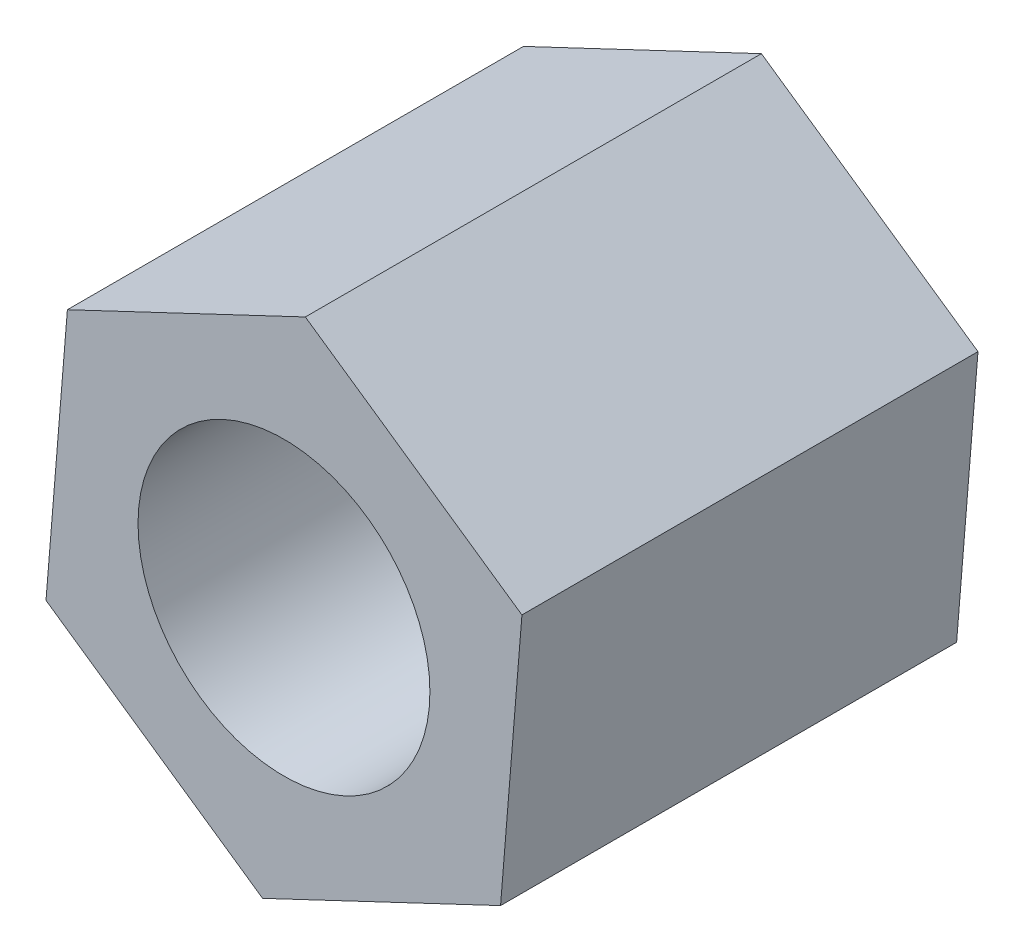
ISO-10303-21;
HEADER;
FILE_DESCRIPTION(('STEP AP214'),'2;1');
FILE_NAME('part.step','',(''),(''),'','','');
FILE_SCHEMA(('AUTOMOTIVE_DESIGN { 1 0 10303 214 1 1 1 1 }'));
ENDSEC;
DATA;
#1=APPLICATION_CONTEXT('core data for automotive mechanical design processes');
#2=APPLICATION_PROTOCOL_DEFINITION('international standard','automotive_design',2000,#1);
#3=PRODUCT_CONTEXT('',#1,'mechanical');
#4=PRODUCT('Part','Part','',(#3));
#5=PRODUCT_RELATED_PRODUCT_CATEGORY('part','',(#4));
#6=PRODUCT_DEFINITION_FORMATION('','',#4);
#7=PRODUCT_DEFINITION_CONTEXT('part definition',#1,'design');
#8=PRODUCT_DEFINITION('design','',#6,#7);
#9=PRODUCT_DEFINITION_SHAPE('','',#8);
#10=(LENGTH_UNIT() NAMED_UNIT(*) SI_UNIT(.MILLI.,.METRE.));
#11=(NAMED_UNIT(*) PLANE_ANGLE_UNIT() SI_UNIT($,.RADIAN.));
#12=(NAMED_UNIT(*) SI_UNIT($,.STERADIAN.) SOLID_ANGLE_UNIT());
#13=UNCERTAINTY_MEASURE_WITH_UNIT(LENGTH_MEASURE(1.E-05),#10,'distance_accuracy_value','');
#14=(GEOMETRIC_REPRESENTATION_CONTEXT(3) GLOBAL_UNCERTAINTY_ASSIGNED_CONTEXT((#13)) GLOBAL_UNIT_ASSIGNED_CONTEXT((#10,
#11,#12)) REPRESENTATION_CONTEXT('',''));
#15=CARTESIAN_POINT('',(0.,0.,0.));
#16=DIRECTION('',(0.,0.,1.));
#17=DIRECTION('',(1.,0.,0.));
#18=AXIS2_PLACEMENT_3D('',#15,#16,#17);
#19=CARTESIAN_POINT('',(0.23444486528615,2.8772154834969,5.));
#20=DIRECTION('',(0.428014880588203,-0.903771686873995,0.));
#21=DIRECTION('',(0.903771686873995,0.428014880588203,0.));
#22=AXIS2_PLACEMENT_3D('',#19,#20,#21);
#23=PLANE('',#22);
#24=DIRECTION('',(-0.903771686873995,-0.428014880588203,0.));
#25=VECTOR('',#24,1.);
#26=CARTESIAN_POINT('',(0.23444486528615,2.8772154834969,0.));
#27=LINE('',#26,#25);
#28=CARTESIAN_POINT('',(0.23444486528615,2.8772154834969,0.));
#29=VERTEX_POINT('',#28);
#30=CARTESIAN_POINT('',(-2.37451926822717,1.64164295087308,0.));
#31=VERTEX_POINT('',#30);
#32=EDGE_CURVE('E116',#29,#31,#27,.T.);
#33=ORIENTED_EDGE('',*,*,#32,.T.);
#34=DIRECTION('',(0.,0.,-1.));
#35=VECTOR('',#34,1.);
#36=CARTESIAN_POINT('',(-2.37451926822717,1.64164295087308,5.));
#37=LINE('',#36,#35);
#38=CARTESIAN_POINT('',(-2.37451926822717,1.64164295087308,5.));
#39=VERTEX_POINT('',#38);
#40=EDGE_CURVE('E11',#39,#31,#37,.T.);
#41=ORIENTED_EDGE('',*,*,#40,.F.);
#42=DIRECTION('',(-0.903771686873995,-0.428014880588203,0.));
#43=VECTOR('',#42,1.);
#44=CARTESIAN_POINT('',(0.23444486528615,2.8772154834969,5.));
#45=LINE('',#44,#43);
#46=CARTESIAN_POINT('',(0.23444486528615,2.8772154834969,5.));
#47=VERTEX_POINT('',#46);
#48=EDGE_CURVE('E127',#47,#39,#45,.T.);
#49=ORIENTED_EDGE('',*,*,#48,.F.);
#50=DIRECTION('',(0.,0.,-1.));
#51=VECTOR('',#50,1.);
#52=CARTESIAN_POINT('',(0.23444486528615,2.8772154834969,5.));
#53=LINE('',#52,#51);
#54=EDGE_CURVE('E112',#47,#29,#53,.T.);
#55=ORIENTED_EDGE('',*,*,#54,.T.);
#56=EDGE_LOOP('',(#33,#41,#49,#55));
#57=FACE_BOUND('',#56,.T.);
#58=ADVANCED_FACE('F32',(#57),#23,.F.);
#59=CARTESIAN_POINT('',(-2.37451926822717,1.64164295087308,5.));
#60=DIRECTION('',(0.996696680348096,-0.0812140836498501,0.));
#61=DIRECTION('',(0.0812140836498501,0.996696680348096,0.));
#62=AXIS2_PLACEMENT_3D('',#59,#60,#61);
#63=PLANE('',#62);
#64=DIRECTION('',(-0.0812140836498501,-0.996696680348096,0.));
#65=VECTOR('',#64,1.);
#66=CARTESIAN_POINT('',(-2.37451926822717,1.64164295087308,0.));
#67=LINE('',#66,#65);
#68=CARTESIAN_POINT('',(-2.60896413351331,-1.23557253262382,0.));
#69=VERTEX_POINT('',#68);
#70=EDGE_CURVE('E119',#31,#69,#67,.T.);
#71=ORIENTED_EDGE('',*,*,#70,.T.);
#72=DIRECTION('',(0.,0.,-1.));
#73=VECTOR('',#72,1.);
#74=CARTESIAN_POINT('',(-2.60896413351331,-1.23557253262382,5.));
#75=LINE('',#74,#73);
#76=CARTESIAN_POINT('',(-2.60896413351331,-1.23557253262382,5.));
#77=VERTEX_POINT('',#76);
#78=EDGE_CURVE('E40',#77,#69,#75,.T.);
#79=ORIENTED_EDGE('',*,*,#78,.F.);
#80=DIRECTION('',(-0.0812140836498501,-0.996696680348096,0.));
#81=VECTOR('',#80,1.);
#82=CARTESIAN_POINT('',(-2.37451926822717,1.64164295087308,5.));
#83=LINE('',#82,#81);
#84=EDGE_CURVE('E85',#39,#77,#83,.T.);
#85=ORIENTED_EDGE('',*,*,#84,.F.);
#86=ORIENTED_EDGE('',*,*,#40,.T.);
#87=EDGE_LOOP('',(#71,#79,#85,#86));
#88=FACE_BOUND('',#87,.T.);
#89=ADVANCED_FACE('F152',(#88),#63,.F.);
#90=CARTESIAN_POINT('',(-2.60896413351331,-1.23557253262382,5.));
#91=DIRECTION('',(0.568681799759893,0.822557603224145,0.));
#92=DIRECTION('',(-0.822557603224145,0.568681799759893,0.));
#93=AXIS2_PLACEMENT_3D('',#90,#91,#92);
#94=PLANE('',#93);
#95=DIRECTION('',(0.822557603224145,-0.568681799759893,0.));
#96=VECTOR('',#95,1.);
#97=CARTESIAN_POINT('',(-2.60896413351331,-1.23557253262382,0.));
#98=LINE('',#97,#96);
#99=CARTESIAN_POINT('',(-0.234444865286149,-2.8772154834969,0.));
#100=VERTEX_POINT('',#99);
#101=EDGE_CURVE('E122',#69,#100,#98,.T.);
#102=ORIENTED_EDGE('',*,*,#101,.T.);
#103=DIRECTION('',(0.,0.,-1.));
#104=VECTOR('',#103,1.);
#105=CARTESIAN_POINT('',(-0.234444865286149,-2.8772154834969,5.));
#106=LINE('',#105,#104);
#107=CARTESIAN_POINT('',(-0.234444865286149,-2.8772154834969,5.));
#108=VERTEX_POINT('',#107);
#109=EDGE_CURVE('E107',#108,#100,#106,.T.);
#110=ORIENTED_EDGE('',*,*,#109,.F.);
#111=DIRECTION('',(0.822557603224145,-0.568681799759893,0.));
#112=VECTOR('',#111,1.);
#113=CARTESIAN_POINT('',(-2.60896413351331,-1.23557253262382,5.));
#114=LINE('',#113,#112);
#115=EDGE_CURVE('E98',#77,#108,#114,.T.);
#116=ORIENTED_EDGE('',*,*,#115,.F.);
#117=ORIENTED_EDGE('',*,*,#78,.T.);
#118=EDGE_LOOP('',(#102,#110,#116,#117));
#119=FACE_BOUND('',#118,.T.);
#120=ADVANCED_FACE('F133',(#119),#94,.F.);
#121=CARTESIAN_POINT('',(-0.234444865286149,-2.8772154834969,5.));
#122=DIRECTION('',(-0.428014880588203,0.903771686873995,0.));
#123=DIRECTION('',(-0.903771686873995,-0.428014880588203,0.));
#124=AXIS2_PLACEMENT_3D('',#121,#122,#123);
#125=PLANE('',#124);
#126=DIRECTION('',(0.903771686873995,0.428014880588203,0.));
#127=VECTOR('',#126,1.);
#128=CARTESIAN_POINT('',(-0.234444865286149,-2.8772154834969,0.));
#129=LINE('',#128,#127);
#130=CARTESIAN_POINT('',(2.37451926822717,-1.64164295087308,0.));
#131=VERTEX_POINT('',#130);
#132=EDGE_CURVE('E106',#100,#131,#129,.T.);
#133=ORIENTED_EDGE('',*,*,#132,.T.);
#134=DIRECTION('',(0.,0.,-1.));
#135=VECTOR('',#134,1.);
#136=CARTESIAN_POINT('',(2.37451926822717,-1.64164295087308,5.));
#137=LINE('',#136,#135);
#138=CARTESIAN_POINT('',(2.37451926822717,-1.64164295087308,5.));
#139=VERTEX_POINT('',#138);
#140=EDGE_CURVE('E103',#139,#131,#137,.T.);
#141=ORIENTED_EDGE('',*,*,#140,.F.);
#142=DIRECTION('',(0.903771686873995,0.428014880588203,0.));
#143=VECTOR('',#142,1.);
#144=CARTESIAN_POINT('',(-0.234444865286149,-2.8772154834969,5.));
#145=LINE('',#144,#143);
#146=EDGE_CURVE('E92',#108,#139,#145,.T.);
#147=ORIENTED_EDGE('',*,*,#146,.F.);
#148=ORIENTED_EDGE('',*,*,#109,.T.);
#149=EDGE_LOOP('',(#133,#141,#147,#148));
#150=FACE_BOUND('',#149,.T.);
#151=ADVANCED_FACE('F104',(#150),#125,.F.);
#152=CARTESIAN_POINT('',(2.37451926822717,-1.64164295087308,5.));
#153=DIRECTION('',(-0.996696680348096,0.0812140836498501,0.));
#154=DIRECTION('',(-0.0812140836498501,-0.996696680348096,0.));
#155=AXIS2_PLACEMENT_3D('',#152,#153,#154);
#156=PLANE('',#155);
#157=DIRECTION('',(0.0812140836498501,0.996696680348096,0.));
#158=VECTOR('',#157,1.);
#159=CARTESIAN_POINT('',(2.37451926822717,-1.64164295087308,0.));
#160=LINE('',#159,#158);
#161=CARTESIAN_POINT('',(2.60896413351331,1.23557253262382,0.));
#162=VERTEX_POINT('',#161);
#163=EDGE_CURVE('E71',#131,#162,#160,.T.);
#164=ORIENTED_EDGE('',*,*,#163,.T.);
#165=DIRECTION('',(0.,0.,-1.));
#166=VECTOR('',#165,1.);
#167=CARTESIAN_POINT('',(2.60896413351331,1.23557253262382,5.));
#168=LINE('',#167,#166);
#169=CARTESIAN_POINT('',(2.60896413351331,1.23557253262382,5.));
#170=VERTEX_POINT('',#169);
#171=EDGE_CURVE('E108',#170,#162,#168,.T.);
#172=ORIENTED_EDGE('',*,*,#171,.F.);
#173=DIRECTION('',(0.0812140836498501,0.996696680348096,0.));
#174=VECTOR('',#173,1.);
#175=CARTESIAN_POINT('',(2.37451926822717,-1.64164295087308,5.));
#176=LINE('',#175,#174);
#177=EDGE_CURVE('E96',#139,#170,#176,.T.);
#178=ORIENTED_EDGE('',*,*,#177,.F.);
#179=ORIENTED_EDGE('',*,*,#140,.T.);
#180=EDGE_LOOP('',(#164,#172,#178,#179));
#181=FACE_BOUND('',#180,.T.);
#182=ADVANCED_FACE('F110',(#181),#156,.F.);
#183=CARTESIAN_POINT('',(2.60896413351331,1.23557253262382,5.));
#184=DIRECTION('',(-0.568681799759893,-0.822557603224144,0.));
#185=DIRECTION('',(0.822557603224144,-0.568681799759893,0.));
#186=AXIS2_PLACEMENT_3D('',#183,#184,#185);
#187=PLANE('',#186);
#188=DIRECTION('',(-0.822557603224144,0.568681799759893,0.));
#189=VECTOR('',#188,1.);
#190=CARTESIAN_POINT('',(2.60896413351331,1.23557253262382,0.));
#191=LINE('',#190,#189);
#192=EDGE_CURVE('E77',#162,#29,#191,.T.);
#193=ORIENTED_EDGE('',*,*,#192,.T.);
#194=ORIENTED_EDGE('',*,*,#54,.F.);
#195=DIRECTION('',(-0.822557603224144,0.568681799759893,0.));
#196=VECTOR('',#195,1.);
#197=CARTESIAN_POINT('',(2.60896413351331,1.23557253262382,5.));
#198=LINE('',#197,#196);
#199=EDGE_CURVE('E48',#170,#47,#198,.T.);
#200=ORIENTED_EDGE('',*,*,#199,.F.);
#201=ORIENTED_EDGE('',*,*,#171,.T.);
#202=EDGE_LOOP('',(#193,#194,#200,#201));
#203=FACE_BOUND('',#202,.T.);
#204=ADVANCED_FACE('F140',(#203),#187,.F.);
#205=CARTESIAN_POINT('',(0.,0.,5.));
#206=DIRECTION('',(0.,0.,1.));
#207=DIRECTION('',(1.,0.,0.));
#208=AXIS2_PLACEMENT_3D('',#205,#206,#207);
#209=PLANE('',#208);
#210=CARTESIAN_POINT('',(0.,0.,5.));
#211=DIRECTION('',(0.,0.,1.));
#212=DIRECTION('',(1.,0.,0.));
#213=AXIS2_PLACEMENT_3D('',#210,#211,#212);
#214=CIRCLE('',#213,1.6);
#215=CARTESIAN_POINT('',(1.6,0.,5.));
#216=VERTEX_POINT('',#215);
#217=EDGE_CURVE('E207',#216,#216,#214,.T.);
#218=ORIENTED_EDGE('',*,*,#217,.F.);
#219=EDGE_LOOP('',(#218));
#220=FACE_BOUND('',#219,.T.);
#221=ORIENTED_EDGE('',*,*,#48,.T.);
#222=ORIENTED_EDGE('',*,*,#84,.T.);
#223=ORIENTED_EDGE('',*,*,#115,.T.);
#224=ORIENTED_EDGE('',*,*,#146,.T.);
#225=ORIENTED_EDGE('',*,*,#177,.T.);
#226=ORIENTED_EDGE('',*,*,#199,.T.);
#227=EDGE_LOOP('',(#221,#222,#223,#224,#225,#226));
#228=FACE_BOUND('',#227,.T.);
#229=ADVANCED_FACE('F94',(#220,#228),#209,.T.);
#230=CARTESIAN_POINT('',(0.,0.,0.));
#231=DIRECTION('',(0.,0.,1.));
#232=DIRECTION('',(1.,0.,0.));
#233=AXIS2_PLACEMENT_3D('',#230,#231,#232);
#234=PLANE('',#233);
#235=CARTESIAN_POINT('',(0.,0.,0.));
#236=DIRECTION('',(0.,0.,1.));
#237=DIRECTION('',(1.,0.,0.));
#238=AXIS2_PLACEMENT_3D('',#235,#236,#237);
#239=CIRCLE('',#238,1.6);
#240=CARTESIAN_POINT('',(1.6,0.,0.));
#241=VERTEX_POINT('',#240);
#242=EDGE_CURVE('E120',#241,#241,#239,.T.);
#243=ORIENTED_EDGE('',*,*,#242,.T.);
#244=EDGE_LOOP('',(#243));
#245=FACE_BOUND('',#244,.T.);
#246=ORIENTED_EDGE('',*,*,#32,.F.);
#247=ORIENTED_EDGE('',*,*,#192,.F.);
#248=ORIENTED_EDGE('',*,*,#163,.F.);
#249=ORIENTED_EDGE('',*,*,#132,.F.);
#250=ORIENTED_EDGE('',*,*,#101,.F.);
#251=ORIENTED_EDGE('',*,*,#70,.F.);
#252=EDGE_LOOP('',(#246,#247,#248,#249,#250,#251));
#253=FACE_BOUND('',#252,.T.);
#254=ADVANCED_FACE('F136',(#245,#253),#234,.F.);
#255=CARTESIAN_POINT('',(0.,0.,0.));
#256=DIRECTION('',(0.,0.,1.));
#257=DIRECTION('',(1.,0.,0.));
#258=AXIS2_PLACEMENT_3D('',#255,#256,#257);
#259=CYLINDRICAL_SURFACE('',#258,1.6);
#260=ORIENTED_EDGE('',*,*,#242,.F.);
#261=EDGE_LOOP('',(#260));
#262=FACE_BOUND('',#261,.T.);
#263=ORIENTED_EDGE('',*,*,#217,.T.);
#264=EDGE_LOOP('',(#263));
#265=FACE_BOUND('',#264,.T.);
#266=ADVANCED_FACE('F189',(#262,#265),#259,.F.);
#267=CLOSED_SHELL('',(#58,#89,#120,#151,#182,#204,#229,#254,#266));
#268=MANIFOLD_SOLID_BREP('B2',#267);
#269=ADVANCED_BREP_SHAPE_REPRESENTATION('',(#18,#268),#14);
#270=SHAPE_DEFINITION_REPRESENTATION(#9,#269);
ENDSEC;
END-ISO-10303-21;
